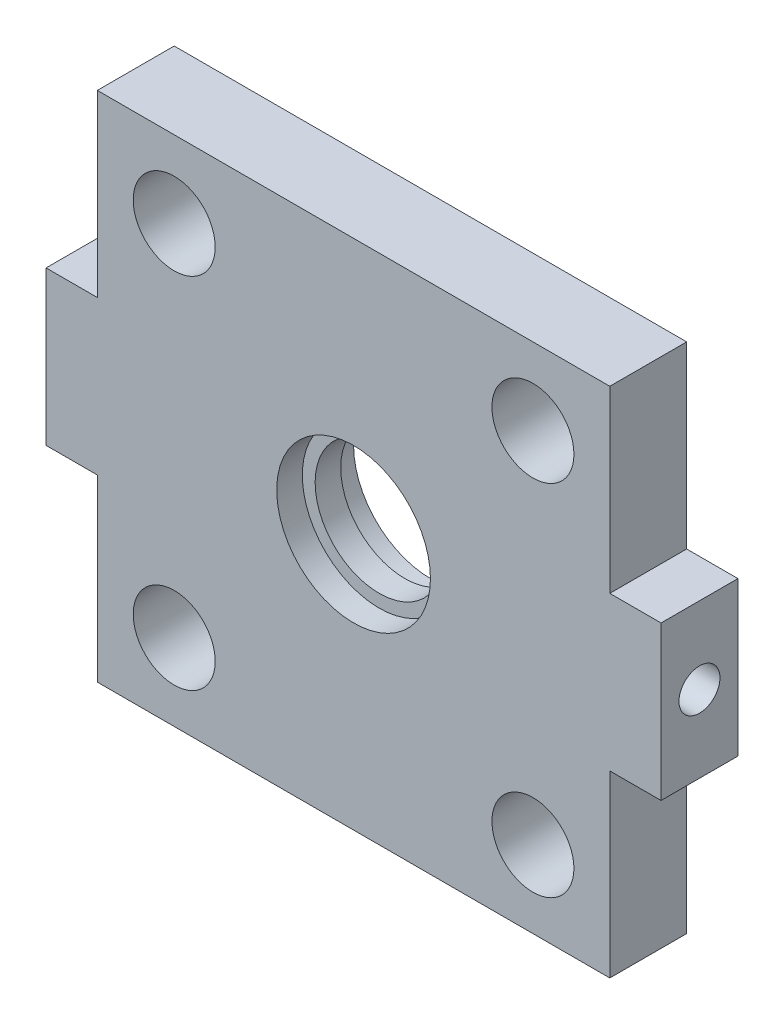
ISO-10303-21;
HEADER;
FILE_DESCRIPTION(('STEP AP214'),'2;1');
FILE_NAME('part.step','',(''),(''),'','','');
FILE_SCHEMA(('AUTOMOTIVE_DESIGN { 1 0 10303 214 1 1 1 1 }'));
ENDSEC;
DATA;
#1=APPLICATION_CONTEXT('core data for automotive mechanical design processes');
#2=APPLICATION_PROTOCOL_DEFINITION('international standard','automotive_design',2000,#1);
#3=PRODUCT_CONTEXT('',#1,'mechanical');
#4=PRODUCT('Part','Part','',(#3));
#5=PRODUCT_RELATED_PRODUCT_CATEGORY('part','',(#4));
#6=PRODUCT_DEFINITION_FORMATION('','',#4);
#7=PRODUCT_DEFINITION_CONTEXT('part definition',#1,'design');
#8=PRODUCT_DEFINITION('design','',#6,#7);
#9=PRODUCT_DEFINITION_SHAPE('','',#8);
#10=(LENGTH_UNIT() NAMED_UNIT(*) SI_UNIT(.MILLI.,.METRE.));
#11=(NAMED_UNIT(*) PLANE_ANGLE_UNIT() SI_UNIT($,.RADIAN.));
#12=(NAMED_UNIT(*) SI_UNIT($,.STERADIAN.) SOLID_ANGLE_UNIT());
#13=UNCERTAINTY_MEASURE_WITH_UNIT(LENGTH_MEASURE(1.E-05),#10,'distance_accuracy_value','');
#14=(GEOMETRIC_REPRESENTATION_CONTEXT(3) GLOBAL_UNCERTAINTY_ASSIGNED_CONTEXT((#13)) GLOBAL_UNIT_ASSIGNED_CONTEXT((#10,
#11,#12)) REPRESENTATION_CONTEXT('',''));
#15=CARTESIAN_POINT('',(0.,0.,0.));
#16=DIRECTION('',(0.,0.,1.));
#17=DIRECTION('',(1.,0.,0.));
#18=AXIS2_PLACEMENT_3D('',#15,#16,#17);
#19=CARTESIAN_POINT('',(0.,0.,15.));
#20=DIRECTION('',(1.,0.,0.));
#21=DIRECTION('',(0.,1.,0.));
#22=AXIS2_PLACEMENT_3D('',#19,#20,#21);
#23=PLANE('',#22);
#24=DIRECTION('',(0.,0.,-1.));
#25=VECTOR('',#24,1.);
#26=CARTESIAN_POINT('',(0.,65.,0.));
#27=LINE('',#26,#25);
#28=CARTESIAN_POINT('',(0.,65.,15.));
#29=VERTEX_POINT('',#28);
#30=CARTESIAN_POINT('',(0.,65.,0.));
#31=VERTEX_POINT('',#30);
#32=EDGE_CURVE('E50',#29,#31,#27,.T.);
#33=ORIENTED_EDGE('',*,*,#32,.F.);
#34=DIRECTION('',(0.,-1.,0.));
#35=VECTOR('',#34,1.);
#36=CARTESIAN_POINT('',(0.,0.,15.));
#37=LINE('',#36,#35);
#38=CARTESIAN_POINT('',(0.,100.,15.));
#39=VERTEX_POINT('',#38);
#40=EDGE_CURVE('E206',#39,#29,#37,.T.);
#41=ORIENTED_EDGE('',*,*,#40,.F.);
#42=DIRECTION('',(0.,0.,-1.));
#43=VECTOR('',#42,1.);
#44=CARTESIAN_POINT('',(0.,100.,15.));
#45=LINE('',#44,#43);
#46=CARTESIAN_POINT('',(0.,100.,0.));
#47=VERTEX_POINT('',#46);
#48=EDGE_CURVE('E217',#39,#47,#45,.T.);
#49=ORIENTED_EDGE('',*,*,#48,.T.);
#50=DIRECTION('',(0.,-1.,0.));
#51=VECTOR('',#50,1.);
#52=CARTESIAN_POINT('',(0.,0.,0.));
#53=LINE('',#52,#51);
#54=EDGE_CURVE('E218',#47,#31,#53,.T.);
#55=ORIENTED_EDGE('',*,*,#54,.T.);
#56=EDGE_LOOP('',(#33,#41,#49,#55));
#57=FACE_BOUND('',#56,.T.);
#58=ADVANCED_FACE('F35',(#57),#23,.F.);
#59=DIRECTION('',(0.,0.,1.));
#60=VECTOR('',#59,1.);
#61=CARTESIAN_POINT('',(0.,35.,0.));
#62=LINE('',#61,#60);
#63=CARTESIAN_POINT('',(0.,35.,0.));
#64=VERTEX_POINT('',#63);
#65=CARTESIAN_POINT('',(0.,35.,15.));
#66=VERTEX_POINT('',#65);
#67=EDGE_CURVE('E58',#64,#66,#62,.T.);
#68=ORIENTED_EDGE('',*,*,#67,.F.);
#69=CARTESIAN_POINT('',(0.,0.,0.));
#70=VERTEX_POINT('',#69);
#71=EDGE_CURVE('E149',#64,#70,#53,.T.);
#72=ORIENTED_EDGE('',*,*,#71,.T.);
#73=DIRECTION('',(0.,0.,-1.));
#74=VECTOR('',#73,1.);
#75=CARTESIAN_POINT('',(0.,0.,15.));
#76=LINE('',#75,#74);
#77=CARTESIAN_POINT('',(0.,0.,15.));
#78=VERTEX_POINT('',#77);
#79=EDGE_CURVE('E11',#78,#70,#76,.T.);
#80=ORIENTED_EDGE('',*,*,#79,.F.);
#81=EDGE_CURVE('E209',#66,#78,#37,.T.);
#82=ORIENTED_EDGE('',*,*,#81,.F.);
#83=EDGE_LOOP('',(#68,#72,#80,#82));
#84=FACE_BOUND('',#83,.T.);
#85=ADVANCED_FACE('F252',(#84),#23,.F.);
#86=CARTESIAN_POINT('',(100.,0.,15.));
#87=DIRECTION('',(-1.,0.,0.));
#88=DIRECTION('',(0.,-1.,0.));
#89=AXIS2_PLACEMENT_3D('',#86,#87,#88);
#90=PLANE('',#89);
#91=DIRECTION('',(0.,0.,1.));
#92=VECTOR('',#91,1.);
#93=CARTESIAN_POINT('',(100.,65.,15.));
#94=LINE('',#93,#92);
#95=CARTESIAN_POINT('',(100.,65.,0.));
#96=VERTEX_POINT('',#95);
#97=CARTESIAN_POINT('',(100.,65.,15.));
#98=VERTEX_POINT('',#97);
#99=EDGE_CURVE('E153',#96,#98,#94,.T.);
#100=ORIENTED_EDGE('',*,*,#99,.F.);
#101=DIRECTION('',(0.,1.,0.));
#102=VECTOR('',#101,1.);
#103=CARTESIAN_POINT('',(100.,0.,0.));
#104=LINE('',#103,#102);
#105=CARTESIAN_POINT('',(100.,100.,0.));
#106=VERTEX_POINT('',#105);
#107=EDGE_CURVE('E222',#96,#106,#104,.T.);
#108=ORIENTED_EDGE('',*,*,#107,.T.);
#109=DIRECTION('',(0.,0.,-1.));
#110=VECTOR('',#109,1.);
#111=CARTESIAN_POINT('',(100.,100.,15.));
#112=LINE('',#111,#110);
#113=CARTESIAN_POINT('',(100.,100.,15.));
#114=VERTEX_POINT('',#113);
#115=EDGE_CURVE('E229',#114,#106,#112,.T.);
#116=ORIENTED_EDGE('',*,*,#115,.F.);
#117=DIRECTION('',(0.,1.,0.));
#118=VECTOR('',#117,1.);
#119=CARTESIAN_POINT('',(100.,0.,15.));
#120=LINE('',#119,#118);
#121=EDGE_CURVE('E211',#98,#114,#120,.T.);
#122=ORIENTED_EDGE('',*,*,#121,.F.);
#123=EDGE_LOOP('',(#100,#108,#116,#122));
#124=FACE_BOUND('',#123,.T.);
#125=ADVANCED_FACE('F272',(#124),#90,.F.);
#126=DIRECTION('',(0.,0.,-1.));
#127=VECTOR('',#126,1.);
#128=CARTESIAN_POINT('',(100.,35.,15.));
#129=LINE('',#128,#127);
#130=CARTESIAN_POINT('',(100.,35.,15.));
#131=VERTEX_POINT('',#130);
#132=CARTESIAN_POINT('',(100.,35.,0.));
#133=VERTEX_POINT('',#132);
#134=EDGE_CURVE('E150',#131,#133,#129,.T.);
#135=ORIENTED_EDGE('',*,*,#134,.F.);
#136=CARTESIAN_POINT('',(100.,0.,15.));
#137=VERTEX_POINT('',#136);
#138=EDGE_CURVE('E212',#137,#131,#120,.T.);
#139=ORIENTED_EDGE('',*,*,#138,.F.);
#140=DIRECTION('',(0.,0.,-1.));
#141=VECTOR('',#140,1.);
#142=CARTESIAN_POINT('',(100.,0.,15.));
#143=LINE('',#142,#141);
#144=CARTESIAN_POINT('',(100.,0.,0.));
#145=VERTEX_POINT('',#144);
#146=EDGE_CURVE('E43',#137,#145,#143,.T.);
#147=ORIENTED_EDGE('',*,*,#146,.T.);
#148=EDGE_CURVE('E223',#145,#133,#104,.T.);
#149=ORIENTED_EDGE('',*,*,#148,.T.);
#150=EDGE_LOOP('',(#135,#139,#147,#149));
#151=FACE_BOUND('',#150,.T.);
#152=ADVANCED_FACE('F237',(#151),#90,.F.);
#153=CARTESIAN_POINT('',(0.,0.,15.));
#154=DIRECTION('',(0.,0.,-1.));
#155=DIRECTION('',(-1.,0.,0.));
#156=AXIS2_PLACEMENT_3D('',#153,#154,#155);
#157=PLANE('',#156);
#158=CARTESIAN_POINT('',(50.,50.,15.));
#159=DIRECTION('',(0.,0.,1.));
#160=DIRECTION('',(1.,0.,0.));
#161=AXIS2_PLACEMENT_3D('',#158,#159,#160);
#162=CIRCLE('',#161,15.);
#163=CARTESIAN_POINT('',(65.,50.,15.));
#164=VERTEX_POINT('',#163);
#165=EDGE_CURVE('E504',#164,#164,#162,.T.);
#166=ORIENTED_EDGE('',*,*,#165,.F.);
#167=EDGE_LOOP('',(#166));
#168=FACE_BOUND('',#167,.T.);
#169=ORIENTED_EDGE('',*,*,#40,.T.);
#170=DIRECTION('',(1.,0.,0.));
#171=VECTOR('',#170,1.);
#172=CARTESIAN_POINT('',(-10.,65.,15.));
#173=LINE('',#172,#171);
#174=CARTESIAN_POINT('',(-10.,65.,15.));
#175=VERTEX_POINT('',#174);
#176=EDGE_CURVE('E155',#175,#29,#173,.T.);
#177=ORIENTED_EDGE('',*,*,#176,.F.);
#178=DIRECTION('',(0.,1.,0.));
#179=VECTOR('',#178,1.);
#180=CARTESIAN_POINT('',(-10.,65.,15.));
#181=LINE('',#180,#179);
#182=CARTESIAN_POINT('',(-10.,35.,15.));
#183=VERTEX_POINT('',#182);
#184=EDGE_CURVE('E134',#183,#175,#181,.T.);
#185=ORIENTED_EDGE('',*,*,#184,.F.);
#186=DIRECTION('',(1.,0.,0.));
#187=VECTOR('',#186,1.);
#188=CARTESIAN_POINT('',(-10.,35.,15.));
#189=LINE('',#188,#187);
#190=EDGE_CURVE('E131',#183,#66,#189,.T.);
#191=ORIENTED_EDGE('',*,*,#190,.T.);
#192=ORIENTED_EDGE('',*,*,#81,.T.);
#193=DIRECTION('',(1.,0.,0.));
#194=VECTOR('',#193,1.);
#195=CARTESIAN_POINT('',(0.,0.,15.));
#196=LINE('',#195,#194);
#197=EDGE_CURVE('E208',#78,#137,#196,.T.);
#198=ORIENTED_EDGE('',*,*,#197,.T.);
#199=ORIENTED_EDGE('',*,*,#138,.T.);
#200=DIRECTION('',(-1.,0.,0.));
#201=VECTOR('',#200,1.);
#202=CARTESIAN_POINT('',(110.,35.,15.));
#203=LINE('',#202,#201);
#204=CARTESIAN_POINT('',(110.,35.,15.));
#205=VERTEX_POINT('',#204);
#206=EDGE_CURVE('E179',#205,#131,#203,.T.);
#207=ORIENTED_EDGE('',*,*,#206,.F.);
#208=DIRECTION('',(0.,-1.,0.));
#209=VECTOR('',#208,1.);
#210=CARTESIAN_POINT('',(110.,65.,15.));
#211=LINE('',#210,#209);
#212=CARTESIAN_POINT('',(110.,65.,15.));
#213=VERTEX_POINT('',#212);
#214=EDGE_CURVE('E159',#213,#205,#211,.T.);
#215=ORIENTED_EDGE('',*,*,#214,.F.);
#216=DIRECTION('',(-1.,0.,0.));
#217=VECTOR('',#216,1.);
#218=CARTESIAN_POINT('',(110.,65.,15.));
#219=LINE('',#218,#217);
#220=EDGE_CURVE('E167',#213,#98,#219,.T.);
#221=ORIENTED_EDGE('',*,*,#220,.T.);
#222=ORIENTED_EDGE('',*,*,#121,.T.);
#223=DIRECTION('',(-1.,0.,0.));
#224=VECTOR('',#223,1.);
#225=CARTESIAN_POINT('',(0.,100.,15.));
#226=LINE('',#225,#224);
#227=EDGE_CURVE('E215',#114,#39,#226,.T.);
#228=ORIENTED_EDGE('',*,*,#227,.T.);
#229=EDGE_LOOP('',(#169,#177,#185,#191,#192,#198,#199,#207,#215,#221,#222,#228));
#230=FACE_BOUND('',#229,.T.);
#231=CARTESIAN_POINT('',(15.,85.,15.));
#232=DIRECTION('',(0.,0.,1.));
#233=DIRECTION('',(1.,0.,0.));
#234=AXIS2_PLACEMENT_3D('',#231,#232,#233);
#235=CIRCLE('',#234,8.);
#236=CARTESIAN_POINT('',(23.,85.,15.));
#237=VERTEX_POINT('',#236);
#238=EDGE_CURVE('E201',#237,#237,#235,.T.);
#239=ORIENTED_EDGE('',*,*,#238,.F.);
#240=EDGE_LOOP('',(#239));
#241=FACE_BOUND('',#240,.T.);
#242=CARTESIAN_POINT('',(85.,85.,15.));
#243=DIRECTION('',(0.,0.,1.));
#244=DIRECTION('',(1.,0.,0.));
#245=AXIS2_PLACEMENT_3D('',#242,#243,#244);
#246=CIRCLE('',#245,8.00000000000001);
#247=CARTESIAN_POINT('',(93.,85.,15.));
#248=VERTEX_POINT('',#247);
#249=EDGE_CURVE('E195',#248,#248,#246,.T.);
#250=ORIENTED_EDGE('',*,*,#249,.F.);
#251=EDGE_LOOP('',(#250));
#252=FACE_BOUND('',#251,.T.);
#253=CARTESIAN_POINT('',(85.,15.,15.));
#254=DIRECTION('',(0.,0.,1.));
#255=DIRECTION('',(1.,0.,0.));
#256=AXIS2_PLACEMENT_3D('',#253,#254,#255);
#257=CIRCLE('',#256,8.);
#258=CARTESIAN_POINT('',(93.,15.,15.));
#259=VERTEX_POINT('',#258);
#260=EDGE_CURVE('E189',#259,#259,#257,.T.);
#261=ORIENTED_EDGE('',*,*,#260,.F.);
#262=EDGE_LOOP('',(#261));
#263=FACE_BOUND('',#262,.T.);
#264=CARTESIAN_POINT('',(15.,15.,15.));
#265=DIRECTION('',(0.,0.,1.));
#266=DIRECTION('',(1.,0.,0.));
#267=AXIS2_PLACEMENT_3D('',#264,#265,#266);
#268=CIRCLE('',#267,8.);
#269=CARTESIAN_POINT('',(23.,15.,15.));
#270=VERTEX_POINT('',#269);
#271=EDGE_CURVE('E183',#270,#270,#268,.T.);
#272=ORIENTED_EDGE('',*,*,#271,.F.);
#273=EDGE_LOOP('',(#272));
#274=FACE_BOUND('',#273,.T.);
#275=ADVANCED_FACE('F247',(#168,#230,#241,#252,#263,#274),#157,.F.);
#276=CARTESIAN_POINT('',(0.,0.,0.));
#277=DIRECTION('',(0.,0.,-1.));
#278=DIRECTION('',(-1.,0.,0.));
#279=AXIS2_PLACEMENT_3D('',#276,#277,#278);
#280=PLANE('',#279);
#281=CARTESIAN_POINT('',(50.,50.,0.));
#282=DIRECTION('',(0.,0.,-1.));
#283=DIRECTION('',(-1.,0.,0.));
#284=AXIS2_PLACEMENT_3D('',#281,#282,#283);
#285=CIRCLE('',#284,15.);
#286=CARTESIAN_POINT('',(35.,50.,0.));
#287=VERTEX_POINT('',#286);
#288=EDGE_CURVE('E500',#287,#287,#285,.T.);
#289=ORIENTED_EDGE('',*,*,#288,.F.);
#290=EDGE_LOOP('',(#289));
#291=FACE_BOUND('',#290,.T.);
#292=CARTESIAN_POINT('',(85.,15.,0.));
#293=DIRECTION('',(0.,0.,1.));
#294=DIRECTION('',(1.,0.,0.));
#295=AXIS2_PLACEMENT_3D('',#292,#293,#294);
#296=CIRCLE('',#295,8.);
#297=CARTESIAN_POINT('',(93.,15.,0.));
#298=VERTEX_POINT('',#297);
#299=EDGE_CURVE('E186',#298,#298,#296,.T.);
#300=ORIENTED_EDGE('',*,*,#299,.T.);
#301=EDGE_LOOP('',(#300));
#302=FACE_BOUND('',#301,.T.);
#303=CARTESIAN_POINT('',(15.,85.,0.));
#304=DIRECTION('',(0.,0.,1.));
#305=DIRECTION('',(1.,0.,0.));
#306=AXIS2_PLACEMENT_3D('',#303,#304,#305);
#307=CIRCLE('',#306,8.);
#308=CARTESIAN_POINT('',(23.,85.,0.));
#309=VERTEX_POINT('',#308);
#310=EDGE_CURVE('E198',#309,#309,#307,.T.);
#311=ORIENTED_EDGE('',*,*,#310,.T.);
#312=EDGE_LOOP('',(#311));
#313=FACE_BOUND('',#312,.T.);
#314=ORIENTED_EDGE('',*,*,#54,.F.);
#315=DIRECTION('',(-1.,0.,0.));
#316=VECTOR('',#315,1.);
#317=CARTESIAN_POINT('',(0.,100.,0.));
#318=LINE('',#317,#316);
#319=EDGE_CURVE('E225',#106,#47,#318,.T.);
#320=ORIENTED_EDGE('',*,*,#319,.F.);
#321=ORIENTED_EDGE('',*,*,#107,.F.);
#322=DIRECTION('',(-1.,0.,0.));
#323=VECTOR('',#322,1.);
#324=CARTESIAN_POINT('',(110.,65.,0.));
#325=LINE('',#324,#323);
#326=CARTESIAN_POINT('',(110.,65.,0.));
#327=VERTEX_POINT('',#326);
#328=EDGE_CURVE('E173',#327,#96,#325,.T.);
#329=ORIENTED_EDGE('',*,*,#328,.F.);
#330=DIRECTION('',(0.,1.,0.));
#331=VECTOR('',#330,1.);
#332=CARTESIAN_POINT('',(110.,65.,0.));
#333=LINE('',#332,#331);
#334=CARTESIAN_POINT('',(110.,35.,0.));
#335=VERTEX_POINT('',#334);
#336=EDGE_CURVE('E164',#335,#327,#333,.T.);
#337=ORIENTED_EDGE('',*,*,#336,.F.);
#338=DIRECTION('',(-1.,0.,0.));
#339=VECTOR('',#338,1.);
#340=CARTESIAN_POINT('',(110.,35.,0.));
#341=LINE('',#340,#339);
#342=EDGE_CURVE('E176',#335,#133,#341,.T.);
#343=ORIENTED_EDGE('',*,*,#342,.T.);
#344=ORIENTED_EDGE('',*,*,#148,.F.);
#345=DIRECTION('',(1.,0.,0.));
#346=VECTOR('',#345,1.);
#347=CARTESIAN_POINT('',(0.,0.,0.));
#348=LINE('',#347,#346);
#349=EDGE_CURVE('E220',#70,#145,#348,.T.);
#350=ORIENTED_EDGE('',*,*,#349,.F.);
#351=ORIENTED_EDGE('',*,*,#71,.F.);
#352=DIRECTION('',(1.,0.,0.));
#353=VECTOR('',#352,1.);
#354=CARTESIAN_POINT('',(-10.,35.,0.));
#355=LINE('',#354,#353);
#356=CARTESIAN_POINT('',(-10.,35.,0.));
#357=VERTEX_POINT('',#356);
#358=EDGE_CURVE('E129',#357,#64,#355,.T.);
#359=ORIENTED_EDGE('',*,*,#358,.F.);
#360=DIRECTION('',(0.,-1.,0.));
#361=VECTOR('',#360,1.);
#362=CARTESIAN_POINT('',(-10.,65.,0.));
#363=LINE('',#362,#361);
#364=CARTESIAN_POINT('',(-10.,65.,0.));
#365=VERTEX_POINT('',#364);
#366=EDGE_CURVE('E135',#365,#357,#363,.T.);
#367=ORIENTED_EDGE('',*,*,#366,.F.);
#368=DIRECTION('',(1.,0.,0.));
#369=VECTOR('',#368,1.);
#370=CARTESIAN_POINT('',(-10.,65.,0.));
#371=LINE('',#370,#369);
#372=EDGE_CURVE('E258',#365,#31,#371,.T.);
#373=ORIENTED_EDGE('',*,*,#372,.T.);
#374=EDGE_LOOP('',(#314,#320,#321,#329,#337,#343,#344,#350,#351,#359,#367,#373));
#375=FACE_BOUND('',#374,.T.);
#376=CARTESIAN_POINT('',(85.,85.,0.));
#377=DIRECTION('',(0.,0.,1.));
#378=DIRECTION('',(1.,0.,0.));
#379=AXIS2_PLACEMENT_3D('',#376,#377,#378);
#380=CIRCLE('',#379,8.00000000000001);
#381=CARTESIAN_POINT('',(93.,85.,0.));
#382=VERTEX_POINT('',#381);
#383=EDGE_CURVE('E192',#382,#382,#380,.T.);
#384=ORIENTED_EDGE('',*,*,#383,.T.);
#385=EDGE_LOOP('',(#384));
#386=FACE_BOUND('',#385,.T.);
#387=CARTESIAN_POINT('',(15.,15.,0.));
#388=DIRECTION('',(0.,0.,1.));
#389=DIRECTION('',(1.,0.,0.));
#390=AXIS2_PLACEMENT_3D('',#387,#388,#389);
#391=CIRCLE('',#390,8.);
#392=CARTESIAN_POINT('',(23.,15.,0.));
#393=VERTEX_POINT('',#392);
#394=EDGE_CURVE('E182',#393,#393,#391,.T.);
#395=ORIENTED_EDGE('',*,*,#394,.T.);
#396=EDGE_LOOP('',(#395));
#397=FACE_BOUND('',#396,.T.);
#398=ADVANCED_FACE('F146',(#291,#302,#313,#375,#386,#397),#280,.T.);
#399=CARTESIAN_POINT('',(0.,0.,15.));
#400=DIRECTION('',(0.,1.,0.));
#401=DIRECTION('',(0.,0.,1.));
#402=AXIS2_PLACEMENT_3D('',#399,#400,#401);
#403=PLANE('',#402);
#404=ORIENTED_EDGE('',*,*,#349,.T.);
#405=ORIENTED_EDGE('',*,*,#146,.F.);
#406=ORIENTED_EDGE('',*,*,#197,.F.);
#407=ORIENTED_EDGE('',*,*,#79,.T.);
#408=EDGE_LOOP('',(#404,#405,#406,#407));
#409=FACE_BOUND('',#408,.T.);
#410=ADVANCED_FACE('F251',(#409),#403,.F.);
#411=CARTESIAN_POINT('',(0.,100.,15.));
#412=DIRECTION('',(0.,-1.,0.));
#413=DIRECTION('',(0.,0.,-1.));
#414=AXIS2_PLACEMENT_3D('',#411,#412,#413);
#415=PLANE('',#414);
#416=ORIENTED_EDGE('',*,*,#319,.T.);
#417=ORIENTED_EDGE('',*,*,#48,.F.);
#418=ORIENTED_EDGE('',*,*,#227,.F.);
#419=ORIENTED_EDGE('',*,*,#115,.T.);
#420=EDGE_LOOP('',(#416,#417,#418,#419));
#421=FACE_BOUND('',#420,.T.);
#422=ADVANCED_FACE('F269',(#421),#415,.F.);
#423=CARTESIAN_POINT('',(15.,85.,15.));
#424=DIRECTION('',(0.,0.,-1.));
#425=DIRECTION('',(-1.,0.,0.));
#426=AXIS2_PLACEMENT_3D('',#423,#424,#425);
#427=CYLINDRICAL_SURFACE('',#426,8.);
#428=ORIENTED_EDGE('',*,*,#238,.T.);
#429=EDGE_LOOP('',(#428));
#430=FACE_BOUND('',#429,.T.);
#431=ORIENTED_EDGE('',*,*,#310,.F.);
#432=EDGE_LOOP('',(#431));
#433=FACE_BOUND('',#432,.T.);
#434=ADVANCED_FACE('F307',(#430,#433),#427,.F.);
#435=CARTESIAN_POINT('',(85.,85.,15.));
#436=DIRECTION('',(0.,0.,-1.));
#437=DIRECTION('',(-1.,0.,0.));
#438=AXIS2_PLACEMENT_3D('',#435,#436,#437);
#439=CYLINDRICAL_SURFACE('',#438,8.00000000000001);
#440=ORIENTED_EDGE('',*,*,#249,.T.);
#441=EDGE_LOOP('',(#440));
#442=FACE_BOUND('',#441,.T.);
#443=ORIENTED_EDGE('',*,*,#383,.F.);
#444=EDGE_LOOP('',(#443));
#445=FACE_BOUND('',#444,.T.);
#446=ADVANCED_FACE('F319',(#442,#445),#439,.F.);
#447=CARTESIAN_POINT('',(85.,15.,15.));
#448=DIRECTION('',(0.,0.,-1.));
#449=DIRECTION('',(-1.,0.,0.));
#450=AXIS2_PLACEMENT_3D('',#447,#448,#449);
#451=CYLINDRICAL_SURFACE('',#450,8.);
#452=ORIENTED_EDGE('',*,*,#260,.T.);
#453=EDGE_LOOP('',(#452));
#454=FACE_BOUND('',#453,.T.);
#455=ORIENTED_EDGE('',*,*,#299,.F.);
#456=EDGE_LOOP('',(#455));
#457=FACE_BOUND('',#456,.T.);
#458=ADVANCED_FACE('F323',(#454,#457),#451,.F.);
#459=CARTESIAN_POINT('',(15.,15.,15.));
#460=DIRECTION('',(0.,0.,-1.));
#461=DIRECTION('',(-1.,0.,0.));
#462=AXIS2_PLACEMENT_3D('',#459,#460,#461);
#463=CYLINDRICAL_SURFACE('',#462,8.);
#464=ORIENTED_EDGE('',*,*,#271,.T.);
#465=EDGE_LOOP('',(#464));
#466=FACE_BOUND('',#465,.T.);
#467=ORIENTED_EDGE('',*,*,#394,.F.);
#468=EDGE_LOOP('',(#467));
#469=FACE_BOUND('',#468,.T.);
#470=ADVANCED_FACE('F327',(#466,#469),#463,.F.);
#471=CARTESIAN_POINT('',(110.,35.,15.));
#472=DIRECTION('',(0.,1.,0.));
#473=DIRECTION('',(-1.,0.,0.));
#474=AXIS2_PLACEMENT_3D('',#471,#472,#473);
#475=PLANE('',#474);
#476=ORIENTED_EDGE('',*,*,#134,.T.);
#477=ORIENTED_EDGE('',*,*,#342,.F.);
#478=DIRECTION('',(0.,0.,-1.));
#479=VECTOR('',#478,1.);
#480=CARTESIAN_POINT('',(110.,35.,15.));
#481=LINE('',#480,#479);
#482=EDGE_CURVE('E162',#205,#335,#481,.T.);
#483=ORIENTED_EDGE('',*,*,#482,.F.);
#484=ORIENTED_EDGE('',*,*,#206,.T.);
#485=EDGE_LOOP('',(#476,#477,#483,#484));
#486=FACE_BOUND('',#485,.T.);
#487=ADVANCED_FACE('F244',(#486),#475,.F.);
#488=CARTESIAN_POINT('',(110.,65.,15.));
#489=DIRECTION('',(0.,-1.,0.));
#490=DIRECTION('',(1.,0.,0.));
#491=AXIS2_PLACEMENT_3D('',#488,#489,#490);
#492=PLANE('',#491);
#493=ORIENTED_EDGE('',*,*,#99,.T.);
#494=ORIENTED_EDGE('',*,*,#220,.F.);
#495=DIRECTION('',(0.,0.,1.));
#496=VECTOR('',#495,1.);
#497=CARTESIAN_POINT('',(110.,65.,15.));
#498=LINE('',#497,#496);
#499=EDGE_CURVE('E166',#327,#213,#498,.T.);
#500=ORIENTED_EDGE('',*,*,#499,.F.);
#501=ORIENTED_EDGE('',*,*,#328,.T.);
#502=EDGE_LOOP('',(#493,#494,#500,#501));
#503=FACE_BOUND('',#502,.T.);
#504=ADVANCED_FACE('F275',(#503),#492,.F.);
#505=CARTESIAN_POINT('',(110.,0.,0.));
#506=DIRECTION('',(1.,0.,0.));
#507=DIRECTION('',(0.,0.,-1.));
#508=AXIS2_PLACEMENT_3D('',#505,#506,#507);
#509=PLANE('',#508);
#510=CARTESIAN_POINT('',(110.,50.,7.5));
#511=DIRECTION('',(1.,0.,0.));
#512=DIRECTION('',(0.,0.,-1.));
#513=AXIS2_PLACEMENT_3D('',#510,#511,#512);
#514=CIRCLE('',#513,4.);
#515=CARTESIAN_POINT('',(110.,50.,3.5));
#516=VERTEX_POINT('',#515);
#517=EDGE_CURVE('E486',#516,#516,#514,.T.);
#518=ORIENTED_EDGE('',*,*,#517,.F.);
#519=EDGE_LOOP('',(#518));
#520=FACE_BOUND('',#519,.T.);
#521=ORIENTED_EDGE('',*,*,#214,.T.);
#522=ORIENTED_EDGE('',*,*,#482,.T.);
#523=ORIENTED_EDGE('',*,*,#336,.T.);
#524=ORIENTED_EDGE('',*,*,#499,.T.);
#525=EDGE_LOOP('',(#521,#522,#523,#524));
#526=FACE_BOUND('',#525,.T.);
#527=ADVANCED_FACE('F278',(#520,#526),#509,.T.);
#528=CARTESIAN_POINT('',(-10.,35.,0.));
#529=DIRECTION('',(0.,1.,0.));
#530=DIRECTION('',(-1.,0.,0.));
#531=AXIS2_PLACEMENT_3D('',#528,#529,#530);
#532=PLANE('',#531);
#533=ORIENTED_EDGE('',*,*,#67,.T.);
#534=ORIENTED_EDGE('',*,*,#190,.F.);
#535=DIRECTION('',(0.,0.,1.));
#536=VECTOR('',#535,1.);
#537=CARTESIAN_POINT('',(-10.,35.,0.));
#538=LINE('',#537,#536);
#539=EDGE_CURVE('E125',#357,#183,#538,.T.);
#540=ORIENTED_EDGE('',*,*,#539,.F.);
#541=ORIENTED_EDGE('',*,*,#358,.T.);
#542=EDGE_LOOP('',(#533,#534,#540,#541));
#543=FACE_BOUND('',#542,.T.);
#544=ADVANCED_FACE('F127',(#543),#532,.F.);
#545=CARTESIAN_POINT('',(-10.,65.,0.));
#546=DIRECTION('',(0.,-1.,0.));
#547=DIRECTION('',(1.,0.,0.));
#548=AXIS2_PLACEMENT_3D('',#545,#546,#547);
#549=PLANE('',#548);
#550=ORIENTED_EDGE('',*,*,#32,.T.);
#551=ORIENTED_EDGE('',*,*,#372,.F.);
#552=DIRECTION('',(0.,0.,-1.));
#553=VECTOR('',#552,1.);
#554=CARTESIAN_POINT('',(-10.,65.,0.));
#555=LINE('',#554,#553);
#556=EDGE_CURVE('E140',#175,#365,#555,.T.);
#557=ORIENTED_EDGE('',*,*,#556,.F.);
#558=ORIENTED_EDGE('',*,*,#176,.T.);
#559=EDGE_LOOP('',(#550,#551,#557,#558));
#560=FACE_BOUND('',#559,.T.);
#561=ADVANCED_FACE('F263',(#560),#549,.F.);
#562=CARTESIAN_POINT('',(-10.,0.,0.));
#563=DIRECTION('',(-1.,0.,0.));
#564=DIRECTION('',(0.,-1.,0.));
#565=AXIS2_PLACEMENT_3D('',#562,#563,#564);
#566=PLANE('',#565);
#567=CARTESIAN_POINT('',(-10.,50.,7.5));
#568=DIRECTION('',(-1.,0.,0.));
#569=DIRECTION('',(0.,-1.,0.));
#570=AXIS2_PLACEMENT_3D('',#567,#568,#569);
#571=CIRCLE('',#570,4.);
#572=CARTESIAN_POINT('',(-10.,46.,7.5));
#573=VERTEX_POINT('',#572);
#574=EDGE_CURVE('E487',#573,#573,#571,.T.);
#575=ORIENTED_EDGE('',*,*,#574,.F.);
#576=EDGE_LOOP('',(#575));
#577=FACE_BOUND('',#576,.T.);
#578=ORIENTED_EDGE('',*,*,#366,.T.);
#579=ORIENTED_EDGE('',*,*,#539,.T.);
#580=ORIENTED_EDGE('',*,*,#184,.T.);
#581=ORIENTED_EDGE('',*,*,#556,.T.);
#582=EDGE_LOOP('',(#578,#579,#580,#581));
#583=FACE_BOUND('',#582,.T.);
#584=ADVANCED_FACE('F138',(#577,#583),#566,.T.);
#585=CARTESIAN_POINT('',(50.,50.,10.));
#586=DIRECTION('',(0.,0.,1.));
#587=DIRECTION('',(1.,0.,0.));
#588=AXIS2_PLACEMENT_3D('',#585,#586,#587);
#589=CYLINDRICAL_SURFACE('',#588,15.);
#590=CARTESIAN_POINT('',(50.,50.,10.));
#591=DIRECTION('',(0.,0.,1.));
#592=DIRECTION('',(1.,0.,0.));
#593=AXIS2_PLACEMENT_3D('',#590,#591,#592);
#594=CIRCLE('',#593,15.);
#595=CARTESIAN_POINT('',(65.,50.,10.));
#596=VERTEX_POINT('',#595);
#597=EDGE_CURVE('E253',#596,#596,#594,.T.);
#598=ORIENTED_EDGE('',*,*,#597,.F.);
#599=EDGE_LOOP('',(#598));
#600=FACE_BOUND('',#599,.T.);
#601=ORIENTED_EDGE('',*,*,#165,.T.);
#602=EDGE_LOOP('',(#601));
#603=FACE_BOUND('',#602,.T.);
#604=ADVANCED_FACE('F380',(#600,#603),#589,.F.);
#605=CARTESIAN_POINT('',(50.,50.,10.));
#606=DIRECTION('',(0.,0.,1.));
#607=DIRECTION('',(1.,0.,0.));
#608=AXIS2_PLACEMENT_3D('',#605,#606,#607);
#609=PLANE('',#608);
#610=CARTESIAN_POINT('',(50.,50.,10.));
#611=DIRECTION('',(0.,0.,1.));
#612=DIRECTION('',(1.,0.,0.));
#613=AXIS2_PLACEMENT_3D('',#610,#611,#612);
#614=CIRCLE('',#613,12.5);
#615=CARTESIAN_POINT('',(37.5,50.,10.));
#616=VERTEX_POINT('',#615);
#617=EDGE_CURVE('E497',#616,#616,#614,.T.);
#618=ORIENTED_EDGE('',*,*,#617,.F.);
#619=EDGE_LOOP('',(#618));
#620=FACE_BOUND('',#619,.T.);
#621=ORIENTED_EDGE('',*,*,#597,.T.);
#622=EDGE_LOOP('',(#621));
#623=FACE_BOUND('',#622,.T.);
#624=ADVANCED_FACE('F384',(#620,#623),#609,.T.);
#625=CARTESIAN_POINT('',(50.,50.,5.));
#626=DIRECTION('',(0.,0.,-1.));
#627=DIRECTION('',(-1.,0.,0.));
#628=AXIS2_PLACEMENT_3D('',#625,#626,#627);
#629=CYLINDRICAL_SURFACE('',#628,15.);
#630=CARTESIAN_POINT('',(50.,50.,5.));
#631=DIRECTION('',(0.,0.,-1.));
#632=DIRECTION('',(-1.,0.,0.));
#633=AXIS2_PLACEMENT_3D('',#630,#631,#632);
#634=CIRCLE('',#633,15.);
#635=CARTESIAN_POINT('',(35.,50.,5.));
#636=VERTEX_POINT('',#635);
#637=EDGE_CURVE('E501',#636,#636,#634,.T.);
#638=ORIENTED_EDGE('',*,*,#637,.F.);
#639=EDGE_LOOP('',(#638));
#640=FACE_BOUND('',#639,.T.);
#641=ORIENTED_EDGE('',*,*,#288,.T.);
#642=EDGE_LOOP('',(#641));
#643=FACE_BOUND('',#642,.T.);
#644=ADVANCED_FACE('F397',(#640,#643),#629,.F.);
#645=CARTESIAN_POINT('',(50.,50.,5.));
#646=DIRECTION('',(0.,0.,-1.));
#647=DIRECTION('',(-1.,0.,0.));
#648=AXIS2_PLACEMENT_3D('',#645,#646,#647);
#649=PLANE('',#648);
#650=CARTESIAN_POINT('',(50.,50.,5.));
#651=DIRECTION('',(0.,0.,-1.));
#652=DIRECTION('',(-1.,0.,0.));
#653=AXIS2_PLACEMENT_3D('',#650,#651,#652);
#654=CIRCLE('',#653,12.5);
#655=CARTESIAN_POINT('',(37.5,50.,5.));
#656=VERTEX_POINT('',#655);
#657=EDGE_CURVE('E38',#656,#656,#654,.T.);
#658=ORIENTED_EDGE('',*,*,#657,.F.);
#659=EDGE_LOOP('',(#658));
#660=FACE_BOUND('',#659,.T.);
#661=ORIENTED_EDGE('',*,*,#637,.T.);
#662=EDGE_LOOP('',(#661));
#663=FACE_BOUND('',#662,.T.);
#664=ADVANCED_FACE('F402',(#660,#663),#649,.T.);
#665=CARTESIAN_POINT('',(50.,50.,15.));
#666=DIRECTION('',(0.,0.,-1.));
#667=DIRECTION('',(-1.,0.,0.));
#668=AXIS2_PLACEMENT_3D('',#665,#666,#667);
#669=CYLINDRICAL_SURFACE('',#668,12.5);
#670=CARTESIAN_POINT('',(37.5,50.,10.));
#671=CARTESIAN_POINT('',(37.5,50.,9.94791666666667));
#672=CARTESIAN_POINT('',(37.5,50.,9.89583333333333));
#673=CARTESIAN_POINT('',(37.5,50.,9.79166666666667));
#674=CARTESIAN_POINT('',(37.5,50.,9.73958333333333));
#675=CARTESIAN_POINT('',(37.5,50.,9.63541666666667));
#676=CARTESIAN_POINT('',(37.5,50.,9.58333333333333));
#677=CARTESIAN_POINT('',(37.5,50.,9.47916666666667));
#678=CARTESIAN_POINT('',(37.5,50.,9.42708333333333));
#679=CARTESIAN_POINT('',(37.5,50.,9.32291666666666));
#680=CARTESIAN_POINT('',(37.5,50.,9.27083333333333));
#681=CARTESIAN_POINT('',(37.5,50.,9.16666666666666));
#682=CARTESIAN_POINT('',(37.5,50.,9.11458333333333));
#683=CARTESIAN_POINT('',(37.5,50.,9.01041666666666));
#684=CARTESIAN_POINT('',(37.5,50.,8.95833333333333));
#685=CARTESIAN_POINT('',(37.5,50.,8.85416666666666));
#686=CARTESIAN_POINT('',(37.5,50.,8.80208333333333));
#687=CARTESIAN_POINT('',(37.5,50.,8.69791666666666));
#688=CARTESIAN_POINT('',(37.5,50.,8.64583333333333));
#689=CARTESIAN_POINT('',(37.5,50.,8.54166666666666));
#690=CARTESIAN_POINT('',(37.5,50.,8.48958333333333));
#691=CARTESIAN_POINT('',(37.5,50.,8.38541666666666));
#692=CARTESIAN_POINT('',(37.5,50.,8.33333333333333));
#693=CARTESIAN_POINT('',(37.5,50.,8.22916666666667));
#694=CARTESIAN_POINT('',(37.5,50.,8.17708333333333));
#695=CARTESIAN_POINT('',(37.5,50.,8.07291666666667));
#696=CARTESIAN_POINT('',(37.5,50.,8.02083333333333));
#697=CARTESIAN_POINT('',(37.5,50.,7.91666666666667));
#698=CARTESIAN_POINT('',(37.5,50.,7.86458333333333));
#699=CARTESIAN_POINT('',(37.5,50.,7.76041666666667));
#700=CARTESIAN_POINT('',(37.5,50.,7.70833333333333));
#701=CARTESIAN_POINT('',(37.5,50.,7.60416666666667));
#702=CARTESIAN_POINT('',(37.5,50.,7.55208333333333));
#703=CARTESIAN_POINT('',(37.5,50.,7.44791666666667));
#704=CARTESIAN_POINT('',(37.5,50.,7.39583333333333));
#705=CARTESIAN_POINT('',(37.5,50.,7.29166666666667));
#706=CARTESIAN_POINT('',(37.5,50.,7.23958333333333));
#707=CARTESIAN_POINT('',(37.5,50.,7.13541666666667));
#708=CARTESIAN_POINT('',(37.5,50.,7.08333333333333));
#709=CARTESIAN_POINT('',(37.5,50.,6.97916666666667));
#710=CARTESIAN_POINT('',(37.5,50.,6.92708333333333));
#711=CARTESIAN_POINT('',(37.5,50.,6.82291666666667));
#712=CARTESIAN_POINT('',(37.5,50.,6.77083333333333));
#713=CARTESIAN_POINT('',(37.5,50.,6.66666666666667));
#714=CARTESIAN_POINT('',(37.5,50.,6.61458333333333));
#715=CARTESIAN_POINT('',(37.5,50.,6.51041666666667));
#716=CARTESIAN_POINT('',(37.5,50.,6.45833333333333));
#717=CARTESIAN_POINT('',(37.5,50.,6.35416666666667));
#718=CARTESIAN_POINT('',(37.5,50.,6.30208333333333));
#719=CARTESIAN_POINT('',(37.5,50.,6.19791666666667));
#720=CARTESIAN_POINT('',(37.5,50.,6.14583333333333));
#721=CARTESIAN_POINT('',(37.5,50.,6.04166666666667));
#722=CARTESIAN_POINT('',(37.5,50.,5.98958333333333));
#723=CARTESIAN_POINT('',(37.5,50.,5.88541666666667));
#724=CARTESIAN_POINT('',(37.5,50.,5.83333333333333));
#725=CARTESIAN_POINT('',(37.5,50.,5.72916666666667));
#726=CARTESIAN_POINT('',(37.5,50.,5.67708333333333));
#727=CARTESIAN_POINT('',(37.5,50.,5.57291666666667));
#728=CARTESIAN_POINT('',(37.5,50.,5.52083333333333));
#729=CARTESIAN_POINT('',(37.5,50.,5.41666666666667));
#730=CARTESIAN_POINT('',(37.5,50.,5.36458333333333));
#731=CARTESIAN_POINT('',(37.5,50.,5.26041666666667));
#732=CARTESIAN_POINT('',(37.5,50.,5.20833333333333));
#733=CARTESIAN_POINT('',(37.5,50.,5.10416666666667));
#734=CARTESIAN_POINT('',(37.5,50.,5.05208333333333));
#735=CARTESIAN_POINT('',(37.5,50.,5.));
#736=B_SPLINE_CURVE_WITH_KNOTS('',3,(#670,#671,#672,#673,#674,#675,#676,#677,#678,#679,#680,
#681,#682,#683,#684,#685,#686,#687,#688,#689,#690,#691,#692,#693,#694,#695,#696,#697,#698,#699,
#700,#701,#702,#703,#704,#705,#706,#707,#708,#709,#710,#711,#712,#713,#714,#715,#716,#717,#718,
#719,#720,#721,#722,#723,#724,#725,#726,#727,#728,#729,#730,#731,#732,#733,#734,#735),
.UNSPECIFIED.,.F.,.F.,(4,2,2,2,2,2,2,2,2,2,2,2,2,2,2,2,2,2,2,2,2,2,2,2,2,2,2,2,2,2,2,2,4),(0.,
0.15625,0.3125,0.46875,0.625000000000001,0.781250000000001,0.937500000000001,1.09375,1.25,
1.40625,1.5625,1.71875,1.875,2.03125,2.1875,2.34375,2.5,2.65625,2.8125,2.96875,3.125,3.28125,
3.4375,3.59375,3.75,3.90625,4.0625,4.21875,4.375,4.53125,4.6875,4.84375,5.),.UNSPECIFIED.);
#737=EDGE_CURVE('BSEAM419',#616,#656,#736,.T.);
#738=ORIENTED_EDGE('',*,*,#617,.T.);
#739=ORIENTED_EDGE('',*,*,#657,.T.);
#740=ORIENTED_EDGE('',*,*,#737,.T.);
#741=ORIENTED_EDGE('',*,*,#737,.F.);
#742=EDGE_LOOP('',(#738,#740,#739,#741));
#743=FACE_BOUND('',#742,.T.);
#744=ADVANCED_FACE('F419',(#743),#669,.F.);
#745=CARTESIAN_POINT('',(90.,50.,7.5));
#746=DIRECTION('',(1.,0.,0.));
#747=DIRECTION('',(0.,0.,-1.));
#748=AXIS2_PLACEMENT_3D('',#745,#746,#747);
#749=CYLINDRICAL_SURFACE('',#748,4.);
#750=CARTESIAN_POINT('',(90.,50.,7.5));
#751=DIRECTION('',(1.,0.,0.));
#752=DIRECTION('',(0.,0.,-1.));
#753=AXIS2_PLACEMENT_3D('',#750,#751,#752);
#754=CIRCLE('',#753,4.);
#755=CARTESIAN_POINT('',(90.,50.,3.5));
#756=VERTEX_POINT('',#755);
#757=EDGE_CURVE('E490',#756,#756,#754,.T.);
#758=ORIENTED_EDGE('',*,*,#757,.F.);
#759=EDGE_LOOP('',(#758));
#760=FACE_BOUND('',#759,.T.);
#761=ORIENTED_EDGE('',*,*,#517,.T.);
#762=EDGE_LOOP('',(#761));
#763=FACE_BOUND('',#762,.T.);
#764=ADVANCED_FACE('F428',(#760,#763),#749,.F.);
#765=CARTESIAN_POINT('',(90.,50.,7.5));
#766=DIRECTION('',(1.,0.,0.));
#767=DIRECTION('',(0.,0.,-1.));
#768=AXIS2_PLACEMENT_3D('',#765,#766,#767);
#769=PLANE('',#768);
#770=ORIENTED_EDGE('',*,*,#757,.T.);
#771=EDGE_LOOP('',(#770));
#772=FACE_BOUND('',#771,.T.);
#773=ADVANCED_FACE('F442',(#772),#769,.T.);
#774=CARTESIAN_POINT('',(9.99999999999999,50.,7.5));
#775=DIRECTION('',(-1.,0.,0.));
#776=DIRECTION('',(0.,-1.,0.));
#777=AXIS2_PLACEMENT_3D('',#774,#775,#776);
#778=CYLINDRICAL_SURFACE('',#777,4.);
#779=CARTESIAN_POINT('',(9.99999999999999,50.,7.5));
#780=DIRECTION('',(-1.,0.,0.));
#781=DIRECTION('',(0.,-1.,0.));
#782=AXIS2_PLACEMENT_3D('',#779,#780,#781);
#783=CIRCLE('',#782,4.);
#784=CARTESIAN_POINT('',(9.99999999999999,46.,7.5));
#785=VERTEX_POINT('',#784);
#786=EDGE_CURVE('E485',#785,#785,#783,.T.);
#787=ORIENTED_EDGE('',*,*,#786,.F.);
#788=EDGE_LOOP('',(#787));
#789=FACE_BOUND('',#788,.T.);
#790=ORIENTED_EDGE('',*,*,#574,.T.);
#791=EDGE_LOOP('',(#790));
#792=FACE_BOUND('',#791,.T.);
#793=ADVANCED_FACE('F452',(#789,#792),#778,.F.);
#794=CARTESIAN_POINT('',(9.99999999999999,50.,7.5));
#795=DIRECTION('',(-1.,0.,0.));
#796=DIRECTION('',(0.,-1.,0.));
#797=AXIS2_PLACEMENT_3D('',#794,#795,#796);
#798=PLANE('',#797);
#799=ORIENTED_EDGE('',*,*,#786,.T.);
#800=EDGE_LOOP('',(#799));
#801=FACE_BOUND('',#800,.T.);
#802=ADVANCED_FACE('F469',(#801),#798,.T.);
#803=CLOSED_SHELL('',(#58,#85,#125,#152,#275,#398,#410,#422,#434,#446,#458,#470,#487,#504,#527,
#544,#561,#584,#604,#624,#644,#664,#744,#764,#773,#793,#802));
#804=MANIFOLD_SOLID_BREP('B2',#803);
#805=ADVANCED_BREP_SHAPE_REPRESENTATION('',(#18,#804),#14);
#806=SHAPE_DEFINITION_REPRESENTATION(#9,#805);
ENDSEC;
END-ISO-10303-21;
